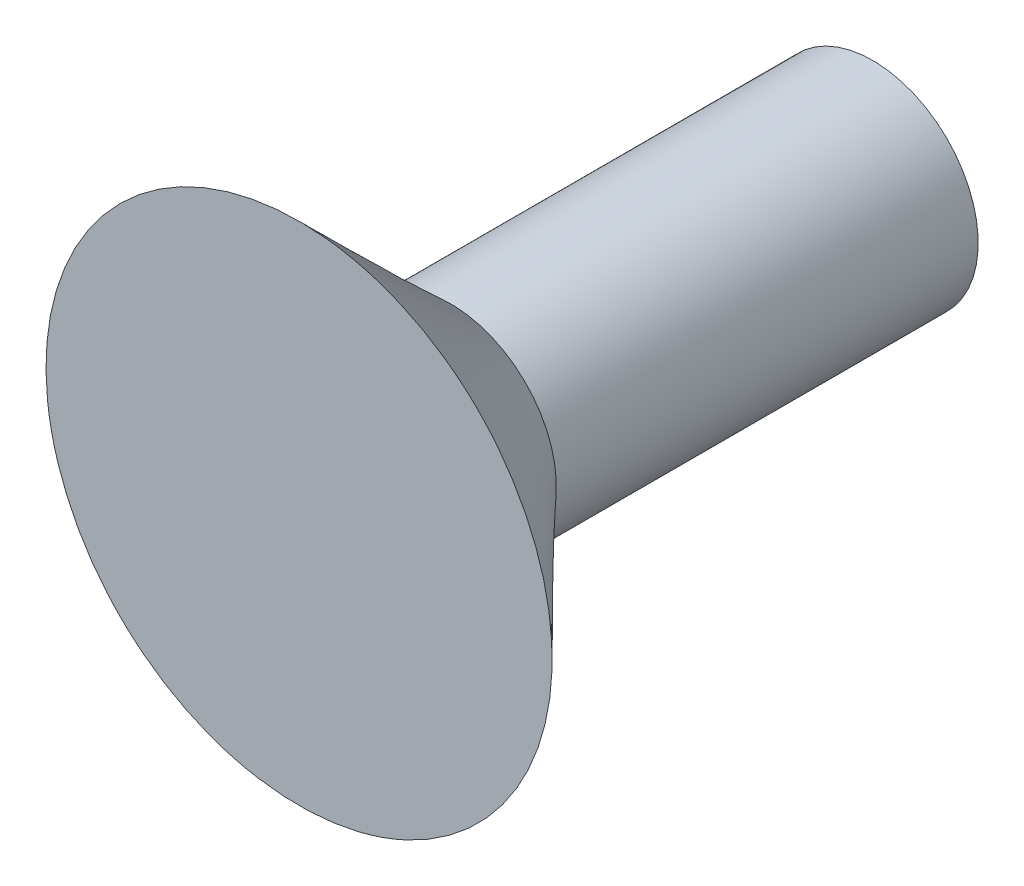
ISO-10303-21;
HEADER;
FILE_DESCRIPTION(('STEP AP214'),'2;1');
FILE_NAME('part.step','',(''),(''),'','','');
FILE_SCHEMA(('AUTOMOTIVE_DESIGN { 1 0 10303 214 1 1 1 1 }'));
ENDSEC;
DATA;
#1=APPLICATION_CONTEXT('core data for automotive mechanical design processes');
#2=APPLICATION_PROTOCOL_DEFINITION('international standard','automotive_design',2000,#1);
#3=PRODUCT_CONTEXT('',#1,'mechanical');
#4=PRODUCT('Part','Part','',(#3));
#5=PRODUCT_RELATED_PRODUCT_CATEGORY('part','',(#4));
#6=PRODUCT_DEFINITION_FORMATION('','',#4);
#7=PRODUCT_DEFINITION_CONTEXT('part definition',#1,'design');
#8=PRODUCT_DEFINITION('design','',#6,#7);
#9=PRODUCT_DEFINITION_SHAPE('','',#8);
#10=(LENGTH_UNIT() NAMED_UNIT(*) SI_UNIT(.MILLI.,.METRE.));
#11=(NAMED_UNIT(*) PLANE_ANGLE_UNIT() SI_UNIT($,.RADIAN.));
#12=(NAMED_UNIT(*) SI_UNIT($,.STERADIAN.) SOLID_ANGLE_UNIT());
#13=UNCERTAINTY_MEASURE_WITH_UNIT(LENGTH_MEASURE(1.E-05),#10,'distance_accuracy_value','');
#14=(GEOMETRIC_REPRESENTATION_CONTEXT(3) GLOBAL_UNCERTAINTY_ASSIGNED_CONTEXT((#13)) GLOBAL_UNIT_ASSIGNED_CONTEXT((#10,
#11,#12)) REPRESENTATION_CONTEXT('',''));
#15=CARTESIAN_POINT('',(0.,0.,0.));
#16=DIRECTION('',(0.,0.,1.));
#17=DIRECTION('',(1.,0.,0.));
#18=AXIS2_PLACEMENT_3D('',#15,#16,#17);
#19=CARTESIAN_POINT('',(0.,3.80450283087695,10.9907859558668));
#20=DIRECTION('',(0.,0.,-1.));
#21=DIRECTION('',(-1.,0.,0.));
#22=AXIS2_PLACEMENT_3D('',#19,#20,#21);
#23=PLANE('',#22);
#24=CARTESIAN_POINT('',(0.,3.80450283087695,10.9907859558668));
#25=DIRECTION('',(0.,0.,-1.));
#26=DIRECTION('',(-1.,0.,0.));
#27=AXIS2_PLACEMENT_3D('',#24,#25,#26);
#28=CIRCLE('',#27,3.);
#29=CARTESIAN_POINT('',(1.46997345493271,6.41968505049248,10.9907859558668));
#30=VERTEX_POINT('',#29);
#31=EDGE_CURVE('E43',#30,#30,#28,.T.);
#32=ORIENTED_EDGE('',*,*,#31,.F.);
#33=EDGE_LOOP('',(#32));
#34=FACE_BOUND('',#33,.T.);
#35=ADVANCED_FACE('F35',(#34),#23,.F.);
#36=CARTESIAN_POINT('',(0.872144306314558,4.69997159580575,9.19078595586678));
#37=CARTESIAN_POINT('',(1.46997345493271,6.41968505049248,10.9907859558668));
#38=CARTESIAN_POINT('',(-0.91879322354303,6.44426020843486,9.19078595586678));
#39=CARTESIAN_POINT('',(-3.76039098429834,9.3596319603579,10.9907859558668));
#40=CARTESIAN_POINT('',(-2.66308183617215,4.65332267857727,9.19078595586678));
#41=CARTESIAN_POINT('',(-6.70033789416376,4.12926752112684,10.9907859558668));
#42=CARTESIAN_POINT('',(-0.872144306314558,2.90903406594816,9.19078595586678));
#43=CARTESIAN_POINT('',(-1.46997345493271,1.18932061126142,10.9907859558668));
#44=CARTESIAN_POINT('',(0.91879322354303,1.16474545331904,9.19078595586678));
#45=CARTESIAN_POINT('',(3.76039098429834,-1.75062629860399,10.9907859558668));
#46=CARTESIAN_POINT('',(2.66308183617214,2.95568298317663,9.19078595586678));
#47=CARTESIAN_POINT('',(6.70033789416376,3.47973814062706,10.9907859558668));
#48=CARTESIAN_POINT('',(0.872144306314558,4.69997159580575,9.19078595586678));
#49=CARTESIAN_POINT('',(1.46997345493271,6.41968505049248,10.9907859558668));
#50=(BOUNDED_SURFACE() B_SPLINE_SURFACE(3,1,((#36,#37),(#38,#39),(#40,#41),(#42,#43),(#44,#45),
(#46,#47),(#48,#49)),.UNSPECIFIED.,.T.,.F.,.F.) B_SPLINE_SURFACE_WITH_KNOTS((4,3,4),(2,2),(0.,
0.5,1.),(0.,1.),.UNSPECIFIED.) GEOMETRIC_REPRESENTATION_ITEM() RATIONAL_B_SPLINE_SURFACE(((1.,
1.),(0.333333333333333,0.333333333333333),(0.333333333333333,0.333333333333333),(1.,1.),
(0.333333333333333,0.333333333333333),(0.333333333333333,0.333333333333333),(1.,1.))) REPRESENTATION_ITEM('') SURFACE());
#51=CARTESIAN_POINT('',(0.,3.80450283087695,9.19078595586678));
#52=DIRECTION('',(0.,0.,-1.));
#53=DIRECTION('',(-1.,0.,0.));
#54=AXIS2_PLACEMENT_3D('',#51,#52,#53);
#55=CIRCLE('',#54,1.25);
#56=CARTESIAN_POINT('',(0.872144306314558,4.69997159580575,9.19078595586678));
#57=VERTEX_POINT('',#56);
#58=EDGE_CURVE('E11',#57,#57,#55,.T.);
#59=CARTESIAN_POINT('',(0.872144306314558,4.69997159580575,9.19078595586678));
#60=CARTESIAN_POINT('',(0.87837169327933,4.7178852776254,9.20953595586678));
#61=CARTESIAN_POINT('',(0.884599080244102,4.73579895944505,9.22828595586678));
#62=CARTESIAN_POINT('',(0.897053854173647,4.77162632308436,9.26578595586678));
#63=CARTESIAN_POINT('',(0.90328124113842,4.78954000490401,9.28453595586678));
#64=CARTESIAN_POINT('',(0.915736015067965,4.82536736854332,9.32203595586678));
#65=CARTESIAN_POINT('',(0.921963402032737,4.84328105036297,9.34078595586678));
#66=CARTESIAN_POINT('',(0.934418175962282,4.87910841400228,9.37828595586678));
#67=CARTESIAN_POINT('',(0.940645562927054,4.89702209582193,9.39703595586678));
#68=CARTESIAN_POINT('',(0.953100336856599,4.93284945946124,9.43453595586678));
#69=CARTESIAN_POINT('',(0.959327723821372,4.95076314128089,9.45328595586678));
#70=CARTESIAN_POINT('',(0.971782497750917,4.9865905049202,9.49078595586678));
#71=CARTESIAN_POINT('',(0.978009884715689,5.00450418673986,9.50953595586678));
#72=CARTESIAN_POINT('',(0.990464658645234,5.04033155037916,9.54703595586678));
#73=CARTESIAN_POINT('',(0.996692045610006,5.05824523219882,9.56578595586678));
#74=CARTESIAN_POINT('',(1.00914681953955,5.09407259583812,9.60328595586678));
#75=CARTESIAN_POINT('',(1.01537420650432,5.11198627765778,9.62203595586678));
#76=CARTESIAN_POINT('',(1.02782898043387,5.14781364129708,9.65953595586678));
#77=CARTESIAN_POINT('',(1.03405636739864,5.16572732311674,9.67828595586678));
#78=CARTESIAN_POINT('',(1.04651114132819,5.20155468675604,9.71578595586678));
#79=CARTESIAN_POINT('',(1.05273852829296,5.2194683685757,9.73453595586678));
#80=CARTESIAN_POINT('',(1.0651933022225,5.255295732215,9.77203595586678));
#81=CARTESIAN_POINT('',(1.07142068918728,5.27320941403466,9.79078595586678));
#82=CARTESIAN_POINT('',(1.08387546311682,5.30903677767396,9.82828595586678));
#83=CARTESIAN_POINT('',(1.09010285008159,5.32695045949362,9.84703595586678));
#84=CARTESIAN_POINT('',(1.10255762401114,5.36277782313292,9.88453595586678));
#85=CARTESIAN_POINT('',(1.10878501097591,5.38069150495258,9.90328595586678));
#86=CARTESIAN_POINT('',(1.12123978490545,5.41651886859188,9.94078595586678));
#87=CARTESIAN_POINT('',(1.12746717187023,5.43443255041154,9.95953595586678));
#88=CARTESIAN_POINT('',(1.13992194579977,5.47025991405084,9.99703595586678));
#89=CARTESIAN_POINT('',(1.14614933276454,5.4881735958705,10.0157859558668));
#90=CARTESIAN_POINT('',(1.15860410669409,5.5240009595098,10.0532859558668));
#91=CARTESIAN_POINT('',(1.16483149365886,5.54191464132946,10.0720359558668));
#92=CARTESIAN_POINT('',(1.17728626758841,5.57774200496877,10.1095359558668));
#93=CARTESIAN_POINT('',(1.18351365455318,5.59565568678842,10.1282859558668));
#94=CARTESIAN_POINT('',(1.19596842848272,5.63148305042773,10.1657859558668));
#95=CARTESIAN_POINT('',(1.2021958154475,5.64939673224738,10.1845359558668));
#96=CARTESIAN_POINT('',(1.21465058937704,5.68522409588669,10.2220359558668));
#97=CARTESIAN_POINT('',(1.22087797634181,5.70313777770634,10.2407859558668));
#98=CARTESIAN_POINT('',(1.23333275027136,5.73896514134565,10.2782859558668));
#99=CARTESIAN_POINT('',(1.23956013723613,5.7568788231653,10.2970359558668));
#100=CARTESIAN_POINT('',(1.25201491116568,5.79270618680461,10.3345359558668));
#101=CARTESIAN_POINT('',(1.25824229813045,5.81061986862426,10.3532859558668));
#102=CARTESIAN_POINT('',(1.27069707205999,5.84644723226357,10.3907859558668));
#103=CARTESIAN_POINT('',(1.27692445902476,5.86436091408322,10.4095359558668));
#104=CARTESIAN_POINT('',(1.28937923295431,5.90018827772253,10.4470359558668));
#105=CARTESIAN_POINT('',(1.29560661991908,5.91810195954218,10.4657859558668));
#106=CARTESIAN_POINT('',(1.30806139384863,5.95392932318149,10.5032859558668));
#107=CARTESIAN_POINT('',(1.3142887808134,5.97184300500114,10.5220359558668));
#108=CARTESIAN_POINT('',(1.32674355474294,6.00767036864045,10.5595359558668));
#109=CARTESIAN_POINT('',(1.33297094170772,6.0255840504601,10.5782859558668));
#110=CARTESIAN_POINT('',(1.34542571563726,6.06141141409941,10.6157859558668));
#111=CARTESIAN_POINT('',(1.35165310260203,6.07932509591906,10.6345359558668));
#112=CARTESIAN_POINT('',(1.36410787653158,6.11515245955837,10.6720359558668));
#113=CARTESIAN_POINT('',(1.37033526349635,6.13306614137802,10.6907859558668));
#114=CARTESIAN_POINT('',(1.3827900374259,6.16889350501733,10.7282859558668));
#115=CARTESIAN_POINT('',(1.38901742439067,6.18680718683698,10.7470359558668));
#116=CARTESIAN_POINT('',(1.40147219832021,6.22263455047629,10.7845359558668));
#117=CARTESIAN_POINT('',(1.40769958528499,6.24054823229594,10.8032859558668));
#118=CARTESIAN_POINT('',(1.42015435921453,6.27637559593525,10.8407859558668));
#119=CARTESIAN_POINT('',(1.4263817461793,6.2942892777549,10.8595359558668));
#120=CARTESIAN_POINT('',(1.43883652010885,6.33011664139421,10.8970359558668));
#121=CARTESIAN_POINT('',(1.44506390707362,6.34803032321387,10.9157859558668));
#122=CARTESIAN_POINT('',(1.45751868100317,6.38385768685317,10.9532859558668));
#123=CARTESIAN_POINT('',(1.46374606796794,6.40177136867283,10.9720359558668));
#124=CARTESIAN_POINT('',(1.46997345493271,6.41968505049248,10.9907859558668));
#125=B_SPLINE_CURVE_WITH_KNOTS('',3,(#59,#60,#61,#62,#63,#64,#65,#66,#67,#68,#69,#70,#71,#72,
#73,#74,#75,#76,#77,#78,#79,#80,#81,#82,#83,#84,#85,#86,#87,#88,#89,#90,#91,#92,#93,#94,#95,#96,
#97,#98,#99,#100,#101,#102,#103,#104,#105,#106,#107,#108,#109,#110,#111,#112,#113,#114,#115,
#116,#117,#118,#119,#120,#121,#122,#123,#124),.UNSPECIFIED.,.F.,.F.,(4,2,2,2,2,2,2,2,2,2,2,2,2,
2,2,2,2,2,2,2,2,2,2,2,2,2,2,2,2,2,2,2,4),(0.,0.0800074096737504,0.160014819347499,
0.240022229021249,0.320029638694998,0.400037048368748,0.480044458042499,0.560051867716247,
0.640059277389996,0.720066687063746,0.800074096737497,0.880081506411246,0.960088916084996,
1.04009632575874,1.12010373543249,1.20011114510625,1.28011855477999,1.36012596445374,
1.44013337412749,1.52014078380124,1.60014819347499,1.68015560314874,1.76016301282249,
1.84017042249624,1.92017783216999,2.00018524184374,2.08019265151749,2.16020006119124,
2.24020747086499,2.32021488053874,2.40022229021249,2.48022969988624,2.56023710955999),.UNSPECIFIED.);
#126=EDGE_CURVE('BSEAM74',#57,#30,#125,.T.);
#127=ORIENTED_EDGE('',*,*,#58,.F.);
#128=ORIENTED_EDGE('',*,*,#31,.T.);
#129=ORIENTED_EDGE('',*,*,#126,.T.);
#130=ORIENTED_EDGE('',*,*,#126,.F.);
#131=EDGE_LOOP('',(#127,#129,#128,#130));
#132=FACE_BOUND('',#131,.T.);
#133=ADVANCED_FACE('F74',(#132),#50,.T.);
#134=CARTESIAN_POINT('',(0.,3.80450283087695,4.19078595586678));
#135=DIRECTION('',(0.,0.,1.));
#136=DIRECTION('',(1.,0.,0.));
#137=AXIS2_PLACEMENT_3D('',#134,#135,#136);
#138=CYLINDRICAL_SURFACE('',#137,1.25);
#139=CARTESIAN_POINT('',(0.,3.80450283087695,4.19078595586678));
#140=DIRECTION('',(0.,0.,-1.));
#141=DIRECTION('',(-1.,0.,0.));
#142=AXIS2_PLACEMENT_3D('',#139,#140,#141);
#143=CIRCLE('',#142,1.25);
#144=CARTESIAN_POINT('',(-1.25,3.80450283087695,4.19078595586678));
#145=VERTEX_POINT('',#144);
#146=EDGE_CURVE('E48',#145,#145,#143,.T.);
#147=ORIENTED_EDGE('',*,*,#146,.F.);
#148=EDGE_LOOP('',(#147));
#149=FACE_BOUND('',#148,.T.);
#150=ORIENTED_EDGE('',*,*,#58,.T.);
#151=EDGE_LOOP('',(#150));
#152=FACE_BOUND('',#151,.T.);
#153=ADVANCED_FACE('F64',(#149,#152),#138,.T.);
#154=CARTESIAN_POINT('',(0.,3.80450283087695,4.19078595586678));
#155=DIRECTION('',(0.,0.,-1.));
#156=DIRECTION('',(-1.,0.,0.));
#157=AXIS2_PLACEMENT_3D('',#154,#155,#156);
#158=PLANE('',#157);
#159=ORIENTED_EDGE('',*,*,#146,.T.);
#160=EDGE_LOOP('',(#159));
#161=FACE_BOUND('',#160,.T.);
#162=ADVANCED_FACE('F73',(#161),#158,.T.);
#163=CLOSED_SHELL('',(#35,#133,#153,#162));
#164=MANIFOLD_SOLID_BREP('B2',#163);
#165=ADVANCED_BREP_SHAPE_REPRESENTATION('',(#18,#164),#14);
#166=SHAPE_DEFINITION_REPRESENTATION(#9,#165);
ENDSEC;
END-ISO-10303-21;
